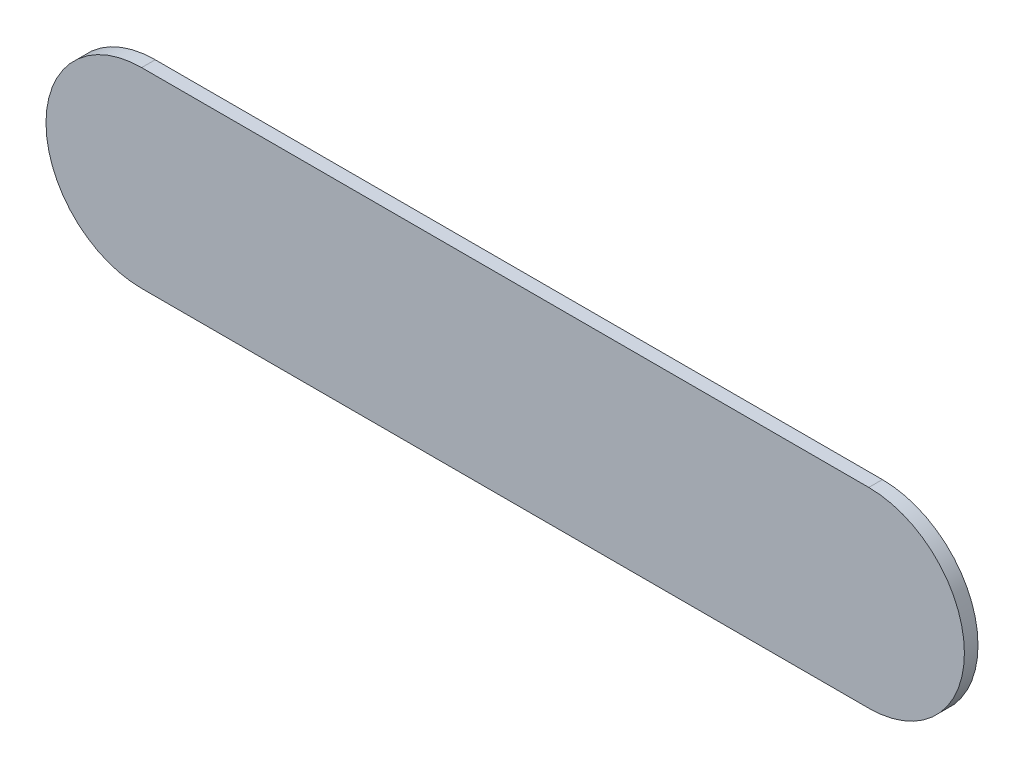
ISO-10303-21;
HEADER;
FILE_DESCRIPTION(('STEP AP214'),'2;1');
FILE_NAME('part.step','',(''),(''),'','','');
FILE_SCHEMA(('AUTOMOTIVE_DESIGN { 1 0 10303 214 1 1 1 1 }'));
ENDSEC;
DATA;
#1=APPLICATION_CONTEXT('core data for automotive mechanical design processes');
#2=APPLICATION_PROTOCOL_DEFINITION('international standard','automotive_design',2000,#1);
#3=PRODUCT_CONTEXT('',#1,'mechanical');
#4=PRODUCT('Part','Part','',(#3));
#5=PRODUCT_RELATED_PRODUCT_CATEGORY('part','',(#4));
#6=PRODUCT_DEFINITION_FORMATION('','',#4);
#7=PRODUCT_DEFINITION_CONTEXT('part definition',#1,'design');
#8=PRODUCT_DEFINITION('design','',#6,#7);
#9=PRODUCT_DEFINITION_SHAPE('','',#8);
#10=(LENGTH_UNIT() NAMED_UNIT(*) SI_UNIT(.MILLI.,.METRE.));
#11=(NAMED_UNIT(*) PLANE_ANGLE_UNIT() SI_UNIT($,.RADIAN.));
#12=(NAMED_UNIT(*) SI_UNIT($,.STERADIAN.) SOLID_ANGLE_UNIT());
#13=UNCERTAINTY_MEASURE_WITH_UNIT(LENGTH_MEASURE(1.E-05),#10,'distance_accuracy_value','');
#14=(GEOMETRIC_REPRESENTATION_CONTEXT(3) GLOBAL_UNCERTAINTY_ASSIGNED_CONTEXT((#13)) GLOBAL_UNIT_ASSIGNED_CONTEXT((#10,
#11,#12)) REPRESENTATION_CONTEXT('',''));
#15=CARTESIAN_POINT('',(0.,0.,0.));
#16=DIRECTION('',(0.,0.,1.));
#17=DIRECTION('',(1.,0.,0.));
#18=AXIS2_PLACEMENT_3D('',#15,#16,#17);
#19=CARTESIAN_POINT('',(92.57700306,95.17201184,0.));
#20=DIRECTION('',(0.,1.,0.));
#21=DIRECTION('',(1.,0.,0.));
#22=AXIS2_PLACEMENT_3D('',#19,#20,#21);
#23=PLANE('',#22);
#24=DIRECTION('',(1.,0.,0.));
#25=VECTOR('',#24,1.);
#26=CARTESIAN_POINT('',(92.57700306,95.17201184,0.03556));
#27=LINE('',#26,#25);
#28=CARTESIAN_POINT('',(92.57700306,95.17201184,0.03556));
#29=VERTEX_POINT('',#28);
#30=CARTESIAN_POINT('',(94.47798986,95.17201184,0.03556));
#31=VERTEX_POINT('',#30);
#32=EDGE_CURVE('E11',#29,#31,#27,.T.);
#33=ORIENTED_EDGE('',*,*,#32,.F.);
#34=DIRECTION('',(0.,0.,1.));
#35=VECTOR('',#34,1.);
#36=CARTESIAN_POINT('',(92.57700306,95.17201184,0.));
#37=LINE('',#36,#35);
#38=CARTESIAN_POINT('',(92.57700306,95.17201184,0.));
#39=VERTEX_POINT('',#38);
#40=EDGE_CURVE('E24',#39,#29,#37,.T.);
#41=ORIENTED_EDGE('',*,*,#40,.F.);
#42=DIRECTION('',(1.,0.,0.));
#43=VECTOR('',#42,1.);
#44=CARTESIAN_POINT('',(92.57700306,95.17201184,0.));
#45=LINE('',#44,#43);
#46=CARTESIAN_POINT('',(94.47798986,95.17201184,0.));
#47=VERTEX_POINT('',#46);
#48=EDGE_CURVE('E75',#39,#47,#45,.T.);
#49=ORIENTED_EDGE('',*,*,#48,.T.);
#50=DIRECTION('',(0.,0.,1.));
#51=VECTOR('',#50,1.);
#52=CARTESIAN_POINT('',(94.47798986,95.17201184,0.));
#53=LINE('',#52,#51);
#54=EDGE_CURVE('E37',#47,#31,#53,.T.);
#55=ORIENTED_EDGE('',*,*,#54,.T.);
#56=EDGE_LOOP('',(#33,#41,#49,#55));
#57=FACE_BOUND('',#56,.T.);
#58=ADVANCED_FACE('F17',(#57),#23,.F.);
#59=CARTESIAN_POINT('',(94.47798986,95.42201134,0.));
#60=DIRECTION('',(0.,0.,-1.));
#61=DIRECTION('',(0.,-1.,0.));
#62=AXIS2_PLACEMENT_3D('',#59,#60,#61);
#63=CYLINDRICAL_SURFACE('',#62,0.249999499999992);
#64=CARTESIAN_POINT('',(94.47798986,95.42201134,0.03556));
#65=DIRECTION('',(0.,0.,1.));
#66=DIRECTION('',(0.,-1.,0.));
#67=AXIS2_PLACEMENT_3D('',#64,#65,#66);
#68=CIRCLE('',#67,0.249999499999992);
#69=CARTESIAN_POINT('',(94.47798986,95.67201084,0.03556));
#70=VERTEX_POINT('',#69);
#71=EDGE_CURVE('E83',#31,#70,#68,.T.);
#72=ORIENTED_EDGE('',*,*,#71,.F.);
#73=ORIENTED_EDGE('',*,*,#54,.F.);
#74=CARTESIAN_POINT('',(94.47798986,95.42201134,0.));
#75=DIRECTION('',(0.,0.,1.));
#76=DIRECTION('',(0.,-1.,0.));
#77=AXIS2_PLACEMENT_3D('',#74,#75,#76);
#78=CIRCLE('',#77,0.249999499999992);
#79=CARTESIAN_POINT('',(94.47798986,95.67201084,0.));
#80=VERTEX_POINT('',#79);
#81=EDGE_CURVE('E81',#47,#80,#78,.T.);
#82=ORIENTED_EDGE('',*,*,#81,.T.);
#83=DIRECTION('',(0.,0.,1.));
#84=VECTOR('',#83,1.);
#85=CARTESIAN_POINT('',(94.47798986,95.67201084,0.));
#86=LINE('',#85,#84);
#87=EDGE_CURVE('E67',#80,#70,#86,.T.);
#88=ORIENTED_EDGE('',*,*,#87,.T.);
#89=EDGE_LOOP('',(#72,#73,#82,#88));
#90=FACE_BOUND('',#89,.T.);
#91=ADVANCED_FACE('F89',(#90),#63,.T.);
#92=CARTESIAN_POINT('',(94.47798986,95.67201084,0.));
#93=DIRECTION('',(0.,-1.,0.));
#94=DIRECTION('',(-1.,0.,0.));
#95=AXIS2_PLACEMENT_3D('',#92,#93,#94);
#96=PLANE('',#95);
#97=DIRECTION('',(-1.,0.,0.));
#98=VECTOR('',#97,1.);
#99=CARTESIAN_POINT('',(94.47798986,95.67201084,0.03556));
#100=LINE('',#99,#98);
#101=CARTESIAN_POINT('',(92.57700306,95.67201084,0.03556));
#102=VERTEX_POINT('',#101);
#103=EDGE_CURVE('E71',#70,#102,#100,.T.);
#104=ORIENTED_EDGE('',*,*,#103,.F.);
#105=ORIENTED_EDGE('',*,*,#87,.F.);
#106=DIRECTION('',(-1.,0.,0.));
#107=VECTOR('',#106,1.);
#108=CARTESIAN_POINT('',(94.47798986,95.67201084,0.));
#109=LINE('',#108,#107);
#110=CARTESIAN_POINT('',(92.57700306,95.67201084,0.));
#111=VERTEX_POINT('',#110);
#112=EDGE_CURVE('E63',#80,#111,#109,.T.);
#113=ORIENTED_EDGE('',*,*,#112,.T.);
#114=DIRECTION('',(0.,0.,1.));
#115=VECTOR('',#114,1.);
#116=CARTESIAN_POINT('',(92.57700306,95.67201084,0.));
#117=LINE('',#116,#115);
#118=EDGE_CURVE('E53',#111,#102,#117,.T.);
#119=ORIENTED_EDGE('',*,*,#118,.T.);
#120=EDGE_LOOP('',(#104,#105,#113,#119));
#121=FACE_BOUND('',#120,.T.);
#122=ADVANCED_FACE('F66',(#121),#96,.F.);
#123=CARTESIAN_POINT('',(92.57700306,95.42201134,0.));
#124=DIRECTION('',(0.,0.,-1.));
#125=DIRECTION('',(0.,1.,0.));
#126=AXIS2_PLACEMENT_3D('',#123,#124,#125);
#127=CYLINDRICAL_SURFACE('',#126,0.249999499999992);
#128=CARTESIAN_POINT('',(92.57700306,95.42201134,0.03556));
#129=DIRECTION('',(0.,0.,1.));
#130=DIRECTION('',(0.,1.,0.));
#131=AXIS2_PLACEMENT_3D('',#128,#129,#130);
#132=CIRCLE('',#131,0.249999499999992);
#133=EDGE_CURVE('E59',#102,#29,#132,.T.);
#134=ORIENTED_EDGE('',*,*,#133,.F.);
#135=ORIENTED_EDGE('',*,*,#118,.F.);
#136=CARTESIAN_POINT('',(92.57700306,95.42201134,0.));
#137=DIRECTION('',(0.,0.,1.));
#138=DIRECTION('',(0.,1.,0.));
#139=AXIS2_PLACEMENT_3D('',#136,#137,#138);
#140=CIRCLE('',#139,0.249999499999992);
#141=EDGE_CURVE('E57',#111,#39,#140,.T.);
#142=ORIENTED_EDGE('',*,*,#141,.T.);
#143=ORIENTED_EDGE('',*,*,#40,.T.);
#144=EDGE_LOOP('',(#134,#135,#142,#143));
#145=FACE_BOUND('',#144,.T.);
#146=ADVANCED_FACE('F55',(#145),#127,.T.);
#147=CARTESIAN_POINT('',(92.57700306,95.17201184,0.));
#148=DIRECTION('',(0.,0.,-1.));
#149=DIRECTION('',(-1.,0.,0.));
#150=AXIS2_PLACEMENT_3D('',#147,#148,#149);
#151=PLANE('',#150);
#152=ORIENTED_EDGE('',*,*,#141,.F.);
#153=ORIENTED_EDGE('',*,*,#112,.F.);
#154=ORIENTED_EDGE('',*,*,#81,.F.);
#155=ORIENTED_EDGE('',*,*,#48,.F.);
#156=EDGE_LOOP('',(#152,#153,#154,#155));
#157=FACE_BOUND('',#156,.T.);
#158=ADVANCED_FACE('F74',(#157),#151,.T.);
#159=CARTESIAN_POINT('',(92.57700306,95.17201184,0.03556));
#160=DIRECTION('',(0.,0.,-1.));
#161=DIRECTION('',(-1.,0.,0.));
#162=AXIS2_PLACEMENT_3D('',#159,#160,#161);
#163=PLANE('',#162);
#164=ORIENTED_EDGE('',*,*,#32,.T.);
#165=ORIENTED_EDGE('',*,*,#71,.T.);
#166=ORIENTED_EDGE('',*,*,#103,.T.);
#167=ORIENTED_EDGE('',*,*,#133,.T.);
#168=EDGE_LOOP('',(#164,#165,#166,#167));
#169=FACE_BOUND('',#168,.T.);
#170=ADVANCED_FACE('F91',(#169),#163,.F.);
#171=CLOSED_SHELL('',(#58,#91,#122,#146,#158,#170));
#172=MANIFOLD_SOLID_BREP('B1',#171);
#173=ADVANCED_BREP_SHAPE_REPRESENTATION('',(#18,#172),#14);
#174=SHAPE_DEFINITION_REPRESENTATION(#9,#173);
ENDSEC;
END-ISO-10303-21;
